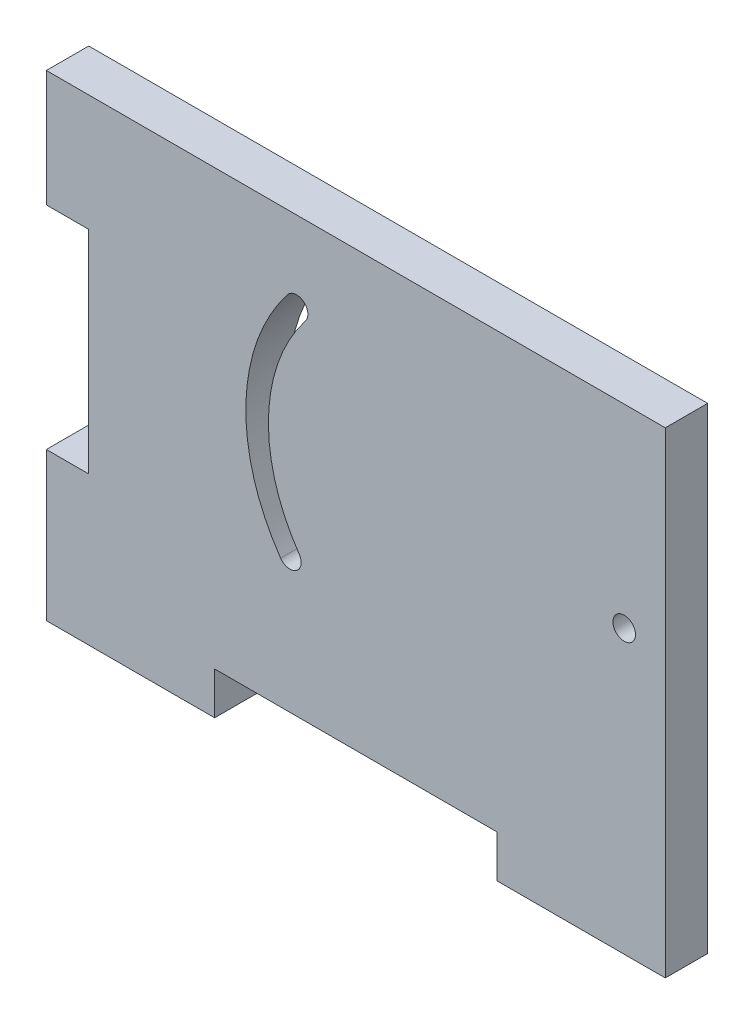
ISO-10303-21;
HEADER;
FILE_DESCRIPTION(('STEP AP214'),'2;1');
FILE_NAME('part.step','',(''),(''),'','','');
FILE_SCHEMA(('AUTOMOTIVE_DESIGN { 1 0 10303 214 1 1 1 1 }'));
ENDSEC;
DATA;
#1=APPLICATION_CONTEXT('core data for automotive mechanical design processes');
#2=APPLICATION_PROTOCOL_DEFINITION('international standard','automotive_design',2000,#1);
#3=PRODUCT_CONTEXT('',#1,'mechanical');
#4=PRODUCT('Part','Part','',(#3));
#5=PRODUCT_RELATED_PRODUCT_CATEGORY('part','',(#4));
#6=PRODUCT_DEFINITION_FORMATION('','',#4);
#7=PRODUCT_DEFINITION_CONTEXT('part definition',#1,'design');
#8=PRODUCT_DEFINITION('design','',#6,#7);
#9=PRODUCT_DEFINITION_SHAPE('','',#8);
#10=(LENGTH_UNIT() NAMED_UNIT(*) SI_UNIT(.MILLI.,.METRE.));
#11=(NAMED_UNIT(*) PLANE_ANGLE_UNIT() SI_UNIT($,.RADIAN.));
#12=(NAMED_UNIT(*) SI_UNIT($,.STERADIAN.) SOLID_ANGLE_UNIT());
#13=UNCERTAINTY_MEASURE_WITH_UNIT(LENGTH_MEASURE(1.E-05),#10,'distance_accuracy_value','');
#14=(GEOMETRIC_REPRESENTATION_CONTEXT(3) GLOBAL_UNCERTAINTY_ASSIGNED_CONTEXT((#13)) GLOBAL_UNIT_ASSIGNED_CONTEXT((#10,
#11,#12)) REPRESENTATION_CONTEXT('',''));
#15=CARTESIAN_POINT('',(0.,0.,0.));
#16=DIRECTION('',(0.,0.,1.));
#17=DIRECTION('',(1.,0.,0.));
#18=AXIS2_PLACEMENT_3D('',#15,#16,#17);
#19=CARTESIAN_POINT('',(-49.8558581563153,0.,6.));
#20=DIRECTION('',(-1.,0.,0.));
#21=DIRECTION('',(0.,-1.,0.));
#22=AXIS2_PLACEMENT_3D('',#19,#20,#21);
#23=PLANE('',#22);
#24=DIRECTION('',(0.,1.,0.));
#25=VECTOR('',#24,1.);
#26=CARTESIAN_POINT('',(-49.8558581563153,0.,0.));
#27=LINE('',#26,#25);
#28=CARTESIAN_POINT('',(-49.8558581563153,-19.,0.));
#29=VERTEX_POINT('',#28);
#30=CARTESIAN_POINT('',(-49.8558581563153,11.,0.));
#31=VERTEX_POINT('',#30);
#32=EDGE_CURVE('E313',#29,#31,#27,.T.);
#33=ORIENTED_EDGE('',*,*,#32,.F.);
#34=DIRECTION('',(0.,0.,-1.));
#35=VECTOR('',#34,1.);
#36=CARTESIAN_POINT('',(-49.8558581563153,-19.,6.));
#37=LINE('',#36,#35);
#38=CARTESIAN_POINT('',(-49.8558581563153,-19.,6.));
#39=VERTEX_POINT('',#38);
#40=EDGE_CURVE('E11',#39,#29,#37,.T.);
#41=ORIENTED_EDGE('',*,*,#40,.F.);
#42=DIRECTION('',(0.,1.,0.));
#43=VECTOR('',#42,1.);
#44=CARTESIAN_POINT('',(-49.8558581563153,0.,6.));
#45=LINE('',#44,#43);
#46=CARTESIAN_POINT('',(-49.8558581563153,11.,6.));
#47=VERTEX_POINT('',#46);
#48=EDGE_CURVE('E211',#39,#47,#45,.T.);
#49=ORIENTED_EDGE('',*,*,#48,.T.);
#50=DIRECTION('',(0.,0.,-1.));
#51=VECTOR('',#50,1.);
#52=CARTESIAN_POINT('',(-49.8558581563153,11.,6.));
#53=LINE('',#52,#51);
#54=EDGE_CURVE('E123',#47,#31,#53,.T.);
#55=ORIENTED_EDGE('',*,*,#54,.T.);
#56=EDGE_LOOP('',(#33,#41,#49,#55));
#57=FACE_BOUND('',#56,.T.);
#58=ADVANCED_FACE('F45',(#57),#23,.T.);
#59=CARTESIAN_POINT('',(0.,-19.,6.));
#60=DIRECTION('',(0.,1.,0.));
#61=DIRECTION('',(0.,0.,1.));
#62=AXIS2_PLACEMENT_3D('',#59,#60,#61);
#63=PLANE('',#62);
#64=DIRECTION('',(1.,0.,0.));
#65=VECTOR('',#64,1.);
#66=CARTESIAN_POINT('',(0.,-19.,0.));
#67=LINE('',#66,#65);
#68=CARTESIAN_POINT('',(-55.8558581563153,-19.,0.));
#69=VERTEX_POINT('',#68);
#70=EDGE_CURVE('E316',#69,#29,#67,.T.);
#71=ORIENTED_EDGE('',*,*,#70,.F.);
#72=DIRECTION('',(0.,0.,-1.));
#73=VECTOR('',#72,1.);
#74=CARTESIAN_POINT('',(-55.8558581563153,-19.,6.));
#75=LINE('',#74,#73);
#76=CARTESIAN_POINT('',(-55.8558581563153,-19.,6.));
#77=VERTEX_POINT('',#76);
#78=EDGE_CURVE('E56',#77,#69,#75,.T.);
#79=ORIENTED_EDGE('',*,*,#78,.F.);
#80=DIRECTION('',(1.,0.,0.));
#81=VECTOR('',#80,1.);
#82=CARTESIAN_POINT('',(0.,-19.,6.));
#83=LINE('',#82,#81);
#84=EDGE_CURVE('E202',#77,#39,#83,.T.);
#85=ORIENTED_EDGE('',*,*,#84,.T.);
#86=ORIENTED_EDGE('',*,*,#40,.T.);
#87=EDGE_LOOP('',(#71,#79,#85,#86));
#88=FACE_BOUND('',#87,.T.);
#89=ADVANCED_FACE('F372',(#88),#63,.T.);
#90=CARTESIAN_POINT('',(-55.8558581563153,0.,6.));
#91=DIRECTION('',(-1.,0.,0.));
#92=DIRECTION('',(0.,0.,1.));
#93=AXIS2_PLACEMENT_3D('',#90,#91,#92);
#94=PLANE('',#93);
#95=DIRECTION('',(0.,1.,0.));
#96=VECTOR('',#95,1.);
#97=CARTESIAN_POINT('',(-55.8558581563153,0.,0.));
#98=LINE('',#97,#96);
#99=CARTESIAN_POINT('',(-55.8558581563153,-40.,0.));
#100=VERTEX_POINT('',#99);
#101=EDGE_CURVE('E241',#100,#69,#98,.T.);
#102=ORIENTED_EDGE('',*,*,#101,.F.);
#103=DIRECTION('',(0.,0.,-1.));
#104=VECTOR('',#103,1.);
#105=CARTESIAN_POINT('',(-55.8558581563153,-40.,6.));
#106=LINE('',#105,#104);
#107=CARTESIAN_POINT('',(-55.8558581563153,-40.,6.));
#108=VERTEX_POINT('',#107);
#109=EDGE_CURVE('E269',#108,#100,#106,.T.);
#110=ORIENTED_EDGE('',*,*,#109,.F.);
#111=DIRECTION('',(0.,1.,0.));
#112=VECTOR('',#111,1.);
#113=CARTESIAN_POINT('',(-55.8558581563153,0.,6.));
#114=LINE('',#113,#112);
#115=EDGE_CURVE('E193',#108,#77,#114,.T.);
#116=ORIENTED_EDGE('',*,*,#115,.T.);
#117=ORIENTED_EDGE('',*,*,#78,.T.);
#118=EDGE_LOOP('',(#102,#110,#116,#117));
#119=FACE_BOUND('',#118,.T.);
#120=ADVANCED_FACE('F370',(#119),#94,.T.);
#121=CARTESIAN_POINT('',(0.,-40.,6.));
#122=DIRECTION('',(0.,1.,0.));
#123=DIRECTION('',(0.,0.,1.));
#124=AXIS2_PLACEMENT_3D('',#121,#122,#123);
#125=PLANE('',#124);
#126=DIRECTION('',(1.,0.,0.));
#127=VECTOR('',#126,1.);
#128=CARTESIAN_POINT('',(0.,-40.,0.));
#129=LINE('',#128,#127);
#130=CARTESIAN_POINT('',(-32.0182630164411,-40.,0.));
#131=VERTEX_POINT('',#130);
#132=EDGE_CURVE('E322',#100,#131,#129,.T.);
#133=ORIENTED_EDGE('',*,*,#132,.T.);
#134=DIRECTION('',(0.,0.,-1.));
#135=VECTOR('',#134,1.);
#136=CARTESIAN_POINT('',(-32.0182630164411,-40.,6.));
#137=LINE('',#136,#135);
#138=CARTESIAN_POINT('',(-32.0182630164411,-40.,6.));
#139=VERTEX_POINT('',#138);
#140=EDGE_CURVE('E265',#139,#131,#137,.T.);
#141=ORIENTED_EDGE('',*,*,#140,.F.);
#142=DIRECTION('',(1.,0.,0.));
#143=VECTOR('',#142,1.);
#144=CARTESIAN_POINT('',(0.,-40.,6.));
#145=LINE('',#144,#143);
#146=EDGE_CURVE('E201',#108,#139,#145,.T.);
#147=ORIENTED_EDGE('',*,*,#146,.F.);
#148=ORIENTED_EDGE('',*,*,#109,.T.);
#149=EDGE_LOOP('',(#133,#141,#147,#148));
#150=FACE_BOUND('',#149,.T.);
#151=ADVANCED_FACE('F369',(#150),#125,.F.);
#152=CARTESIAN_POINT('',(-32.0182630164411,0.,6.));
#153=DIRECTION('',(-1.,0.,0.));
#154=DIRECTION('',(0.,0.,1.));
#155=AXIS2_PLACEMENT_3D('',#152,#153,#154);
#156=PLANE('',#155);
#157=DIRECTION('',(0.,1.,0.));
#158=VECTOR('',#157,1.);
#159=CARTESIAN_POINT('',(-32.0182630164411,0.,0.));
#160=LINE('',#159,#158);
#161=CARTESIAN_POINT('',(-32.0182630164411,-34.,0.));
#162=VERTEX_POINT('',#161);
#163=EDGE_CURVE('E326',#131,#162,#160,.T.);
#164=ORIENTED_EDGE('',*,*,#163,.T.);
#165=DIRECTION('',(0.,0.,-1.));
#166=VECTOR('',#165,1.);
#167=CARTESIAN_POINT('',(-32.0182630164411,-34.,6.));
#168=LINE('',#167,#166);
#169=CARTESIAN_POINT('',(-32.0182630164411,-34.,6.));
#170=VERTEX_POINT('',#169);
#171=EDGE_CURVE('E261',#170,#162,#168,.T.);
#172=ORIENTED_EDGE('',*,*,#171,.F.);
#173=DIRECTION('',(0.,1.,0.));
#174=VECTOR('',#173,1.);
#175=CARTESIAN_POINT('',(-32.0182630164411,0.,6.));
#176=LINE('',#175,#174);
#177=EDGE_CURVE('E208',#139,#170,#176,.T.);
#178=ORIENTED_EDGE('',*,*,#177,.F.);
#179=ORIENTED_EDGE('',*,*,#140,.T.);
#180=EDGE_LOOP('',(#164,#172,#178,#179));
#181=FACE_BOUND('',#180,.T.);
#182=ADVANCED_FACE('F365',(#181),#156,.F.);
#183=CARTESIAN_POINT('',(0.,-34.,6.));
#184=DIRECTION('',(0.,1.,0.));
#185=DIRECTION('',(0.,0.,1.));
#186=AXIS2_PLACEMENT_3D('',#183,#184,#185);
#187=PLANE('',#186);
#188=DIRECTION('',(1.,0.,0.));
#189=VECTOR('',#188,1.);
#190=CARTESIAN_POINT('',(0.,-34.,0.));
#191=LINE('',#190,#189);
#192=CARTESIAN_POINT('',(7.98173698355886,-34.,0.));
#193=VERTEX_POINT('',#192);
#194=EDGE_CURVE('E331',#162,#193,#191,.T.);
#195=ORIENTED_EDGE('',*,*,#194,.T.);
#196=DIRECTION('',(0.,0.,-1.));
#197=VECTOR('',#196,1.);
#198=CARTESIAN_POINT('',(7.98173698355886,-34.,6.));
#199=LINE('',#198,#197);
#200=CARTESIAN_POINT('',(7.98173698355886,-34.,6.));
#201=VERTEX_POINT('',#200);
#202=EDGE_CURVE('E258',#201,#193,#199,.T.);
#203=ORIENTED_EDGE('',*,*,#202,.F.);
#204=DIRECTION('',(1.,0.,0.));
#205=VECTOR('',#204,1.);
#206=CARTESIAN_POINT('',(0.,-34.,6.));
#207=LINE('',#206,#205);
#208=EDGE_CURVE('E573',#170,#201,#207,.T.);
#209=ORIENTED_EDGE('',*,*,#208,.F.);
#210=ORIENTED_EDGE('',*,*,#171,.T.);
#211=EDGE_LOOP('',(#195,#203,#209,#210));
#212=FACE_BOUND('',#211,.T.);
#213=ADVANCED_FACE('F359',(#212),#187,.F.);
#214=CARTESIAN_POINT('',(7.98173698355886,0.,6.));
#215=DIRECTION('',(-1.,0.,0.));
#216=DIRECTION('',(0.,0.,1.));
#217=AXIS2_PLACEMENT_3D('',#214,#215,#216);
#218=PLANE('',#217);
#219=DIRECTION('',(0.,1.,0.));
#220=VECTOR('',#219,1.);
#221=CARTESIAN_POINT('',(7.98173698355886,0.,0.));
#222=LINE('',#221,#220);
#223=CARTESIAN_POINT('',(7.98173698355886,-40.,0.));
#224=VERTEX_POINT('',#223);
#225=EDGE_CURVE('E335',#224,#193,#222,.T.);
#226=ORIENTED_EDGE('',*,*,#225,.F.);
#227=DIRECTION('',(0.,0.,-1.));
#228=VECTOR('',#227,1.);
#229=CARTESIAN_POINT('',(7.98173698355886,-40.,6.));
#230=LINE('',#229,#228);
#231=CARTESIAN_POINT('',(7.98173698355886,-40.,6.));
#232=VERTEX_POINT('',#231);
#233=EDGE_CURVE('E255',#232,#224,#230,.T.);
#234=ORIENTED_EDGE('',*,*,#233,.F.);
#235=DIRECTION('',(0.,1.,0.));
#236=VECTOR('',#235,1.);
#237=CARTESIAN_POINT('',(7.98173698355886,0.,6.));
#238=LINE('',#237,#236);
#239=EDGE_CURVE('E357',#232,#201,#238,.T.);
#240=ORIENTED_EDGE('',*,*,#239,.T.);
#241=ORIENTED_EDGE('',*,*,#202,.T.);
#242=EDGE_LOOP('',(#226,#234,#240,#241));
#243=FACE_BOUND('',#242,.T.);
#244=ADVANCED_FACE('F353',(#243),#218,.T.);
#245=CARTESIAN_POINT('',(31.819332123433,-40.,0.));
#246=VERTEX_POINT('',#245);
#247=EDGE_CURVE('E327',#224,#246,#129,.T.);
#248=ORIENTED_EDGE('',*,*,#247,.T.);
#249=DIRECTION('',(0.,0.,-1.));
#250=VECTOR('',#249,1.);
#251=CARTESIAN_POINT('',(31.819332123433,-40.,6.));
#252=LINE('',#251,#250);
#253=CARTESIAN_POINT('',(31.819332123433,-40.,6.));
#254=VERTEX_POINT('',#253);
#255=EDGE_CURVE('E251',#254,#246,#252,.T.);
#256=ORIENTED_EDGE('',*,*,#255,.F.);
#257=EDGE_CURVE('E209',#232,#254,#145,.T.);
#258=ORIENTED_EDGE('',*,*,#257,.F.);
#259=ORIENTED_EDGE('',*,*,#233,.T.);
#260=EDGE_LOOP('',(#248,#256,#258,#259));
#261=FACE_BOUND('',#260,.T.);
#262=ADVANCED_FACE('F348',(#261),#125,.F.);
#263=CARTESIAN_POINT('',(31.819332123433,0.,6.));
#264=DIRECTION('',(-1.,0.,0.));
#265=DIRECTION('',(0.,0.,1.));
#266=AXIS2_PLACEMENT_3D('',#263,#264,#265);
#267=PLANE('',#266);
#268=DIRECTION('',(0.,1.,0.));
#269=VECTOR('',#268,1.);
#270=CARTESIAN_POINT('',(31.819332123433,0.,0.));
#271=LINE('',#270,#269);
#272=CARTESIAN_POINT('',(31.819332123433,27.4983223368587,0.));
#273=VERTEX_POINT('',#272);
#274=EDGE_CURVE('E338',#246,#273,#271,.T.);
#275=ORIENTED_EDGE('',*,*,#274,.T.);
#276=DIRECTION('',(0.,0.,-1.));
#277=VECTOR('',#276,1.);
#278=CARTESIAN_POINT('',(31.819332123433,27.4983223368587,6.));
#279=LINE('',#278,#277);
#280=CARTESIAN_POINT('',(31.819332123433,27.4983223368587,6.));
#281=VERTEX_POINT('',#280);
#282=EDGE_CURVE('E181',#281,#273,#279,.T.);
#283=ORIENTED_EDGE('',*,*,#282,.F.);
#284=DIRECTION('',(0.,1.,0.));
#285=VECTOR('',#284,1.);
#286=CARTESIAN_POINT('',(31.819332123433,0.,6.));
#287=LINE('',#286,#285);
#288=EDGE_CURVE('E186',#254,#281,#287,.T.);
#289=ORIENTED_EDGE('',*,*,#288,.F.);
#290=ORIENTED_EDGE('',*,*,#255,.T.);
#291=EDGE_LOOP('',(#275,#283,#289,#290));
#292=FACE_BOUND('',#291,.T.);
#293=ADVANCED_FACE('F403',(#292),#267,.F.);
#294=CARTESIAN_POINT('',(0.,27.4983223368587,6.));
#295=DIRECTION('',(0.,1.,0.));
#296=DIRECTION('',(-1.,0.,0.));
#297=AXIS2_PLACEMENT_3D('',#294,#295,#296);
#298=PLANE('',#297);
#299=DIRECTION('',(1.,0.,0.));
#300=VECTOR('',#299,1.);
#301=CARTESIAN_POINT('',(0.,27.4983223368587,0.));
#302=LINE('',#301,#300);
#303=CARTESIAN_POINT('',(-55.8558581563153,27.4983223368587,0.));
#304=VERTEX_POINT('',#303);
#305=EDGE_CURVE('E175',#304,#273,#302,.T.);
#306=ORIENTED_EDGE('',*,*,#305,.F.);
#307=DIRECTION('',(0.,0.,-1.));
#308=VECTOR('',#307,1.);
#309=CARTESIAN_POINT('',(-55.8558581563153,27.4983223368587,6.));
#310=LINE('',#309,#308);
#311=CARTESIAN_POINT('',(-55.8558581563153,27.4983223368587,6.));
#312=VERTEX_POINT('',#311);
#313=EDGE_CURVE('E170',#312,#304,#310,.T.);
#314=ORIENTED_EDGE('',*,*,#313,.F.);
#315=DIRECTION('',(1.,0.,0.));
#316=VECTOR('',#315,1.);
#317=CARTESIAN_POINT('',(0.,27.4983223368587,6.));
#318=LINE('',#317,#316);
#319=EDGE_CURVE('E173',#312,#281,#318,.T.);
#320=ORIENTED_EDGE('',*,*,#319,.T.);
#321=ORIENTED_EDGE('',*,*,#282,.T.);
#322=EDGE_LOOP('',(#306,#314,#320,#321));
#323=FACE_BOUND('',#322,.T.);
#324=ADVANCED_FACE('F172',(#323),#298,.T.);
#325=CARTESIAN_POINT('',(-55.8558581563153,11.,0.));
#326=VERTEX_POINT('',#325);
#327=EDGE_CURVE('E236',#326,#304,#98,.T.);
#328=ORIENTED_EDGE('',*,*,#327,.F.);
#329=DIRECTION('',(0.,0.,-1.));
#330=VECTOR('',#329,1.);
#331=CARTESIAN_POINT('',(-55.8558581563153,11.,6.));
#332=LINE('',#331,#330);
#333=CARTESIAN_POINT('',(-55.8558581563153,11.,6.));
#334=VERTEX_POINT('',#333);
#335=EDGE_CURVE('E116',#334,#326,#332,.T.);
#336=ORIENTED_EDGE('',*,*,#335,.F.);
#337=EDGE_CURVE('E184',#334,#312,#114,.T.);
#338=ORIENTED_EDGE('',*,*,#337,.T.);
#339=ORIENTED_EDGE('',*,*,#313,.T.);
#340=EDGE_LOOP('',(#328,#336,#338,#339));
#341=FACE_BOUND('',#340,.T.);
#342=ADVANCED_FACE('F190',(#341),#94,.T.);
#343=CARTESIAN_POINT('',(-21.3570685447965,-14.8282036394454,6.));
#344=DIRECTION('',(0.,0.,-1.));
#345=DIRECTION('',(-1.,0.,0.));
#346=AXIS2_PLACEMENT_3D('',#343,#344,#345);
#347=CYLINDRICAL_SURFACE('',#346,1.6);
#348=CARTESIAN_POINT('',(-21.3570685447965,-14.8282036394454,0.));
#349=DIRECTION('',(0.,0.,1.));
#350=DIRECTION('',(1.,0.,0.));
#351=AXIS2_PLACEMENT_3D('',#348,#349,#350);
#352=CIRCLE('',#351,1.6);
#353=CARTESIAN_POINT('',(-22.6713496860148,-15.7407084787959,0.));
#354=VERTEX_POINT('',#353);
#355=CARTESIAN_POINT('',(-20.0427874035783,-13.9156988000949,0.));
#356=VERTEX_POINT('',#355);
#357=EDGE_CURVE('E291',#354,#356,#352,.T.);
#358=ORIENTED_EDGE('',*,*,#357,.F.);
#359=DIRECTION('',(0.,0.,-1.));
#360=VECTOR('',#359,1.);
#361=CARTESIAN_POINT('',(-22.6713496860148,-15.7407084787959,6.));
#362=LINE('',#361,#360);
#363=CARTESIAN_POINT('',(-22.6713496860148,-15.7407084787959,6.));
#364=VERTEX_POINT('',#363);
#365=EDGE_CURVE('E49',#364,#354,#362,.T.);
#366=ORIENTED_EDGE('',*,*,#365,.F.);
#367=CARTESIAN_POINT('',(-21.3570685447965,-14.8282036394454,6.));
#368=DIRECTION('',(0.,0.,1.));
#369=DIRECTION('',(1.,0.,0.));
#370=AXIS2_PLACEMENT_3D('',#367,#368,#369);
#371=CIRCLE('',#370,1.6);
#372=CARTESIAN_POINT('',(-20.0427874035783,-13.9156988000949,6.));
#373=VERTEX_POINT('',#372);
#374=EDGE_CURVE('E232',#364,#373,#371,.T.);
#375=ORIENTED_EDGE('',*,*,#374,.T.);
#376=DIRECTION('',(0.,0.,-1.));
#377=VECTOR('',#376,1.);
#378=CARTESIAN_POINT('',(-20.0427874035783,-13.9156988000949,6.));
#379=LINE('',#378,#377);
#380=EDGE_CURVE('E195',#373,#356,#379,.T.);
#381=ORIENTED_EDGE('',*,*,#380,.T.);
#382=EDGE_LOOP('',(#358,#366,#375,#381));
#383=FACE_BOUND('',#382,.T.);
#384=ADVANCED_FACE('F47',(#383),#347,.F.);
#385=CARTESIAN_POINT('',(0.,0.,6.));
#386=DIRECTION('',(0.,0.,-1.));
#387=DIRECTION('',(-1.,0.,0.));
#388=AXIS2_PLACEMENT_3D('',#385,#386,#387);
#389=CYLINDRICAL_SURFACE('',#388,27.6);
#390=CARTESIAN_POINT('',(0.,0.,0.));
#391=DIRECTION('',(0.,0.,1.));
#392=DIRECTION('',(1.,0.,0.));
#393=AXIS2_PLACEMENT_3D('',#390,#391,#392);
#394=CIRCLE('',#393,27.6);
#395=CARTESIAN_POINT('',(-21.6675285766619,17.0961459218018,0.));
#396=VERTEX_POINT('',#395);
#397=EDGE_CURVE('E287',#396,#354,#394,.T.);
#398=ORIENTED_EDGE('',*,*,#397,.F.);
#399=DIRECTION('',(0.,0.,-1.));
#400=VECTOR('',#399,1.);
#401=CARTESIAN_POINT('',(-21.6675285766619,17.0961459218018,6.));
#402=LINE('',#401,#400);
#403=CARTESIAN_POINT('',(-21.6675285766619,17.0961459218018,6.));
#404=VERTEX_POINT('',#403);
#405=EDGE_CURVE('E278',#404,#396,#402,.T.);
#406=ORIENTED_EDGE('',*,*,#405,.F.);
#407=CARTESIAN_POINT('',(0.,0.,6.));
#408=DIRECTION('',(0.,0.,1.));
#409=DIRECTION('',(1.,0.,0.));
#410=AXIS2_PLACEMENT_3D('',#407,#408,#409);
#411=CIRCLE('',#410,27.6);
#412=EDGE_CURVE('E228',#404,#364,#411,.T.);
#413=ORIENTED_EDGE('',*,*,#412,.T.);
#414=ORIENTED_EDGE('',*,*,#365,.T.);
#415=EDGE_LOOP('',(#398,#406,#413,#414));
#416=FACE_BOUND('',#415,.T.);
#417=ADVANCED_FACE('F285',(#416),#389,.F.);
#418=CARTESIAN_POINT('',(-20.4114399635221,16.1050649987988,6.));
#419=DIRECTION('',(0.,0.,-1.));
#420=DIRECTION('',(-1.,0.,0.));
#421=AXIS2_PLACEMENT_3D('',#418,#419,#420);
#422=CYLINDRICAL_SURFACE('',#421,1.6);
#423=CARTESIAN_POINT('',(-20.4114399635221,16.1050649987988,0.));
#424=DIRECTION('',(0.,0.,1.));
#425=DIRECTION('',(1.,0.,0.));
#426=AXIS2_PLACEMENT_3D('',#423,#424,#425);
#427=CIRCLE('',#426,1.6);
#428=CARTESIAN_POINT('',(-19.1553513503823,15.1139840757958,0.));
#429=VERTEX_POINT('',#428);
#430=EDGE_CURVE('E300',#429,#396,#427,.T.);
#431=ORIENTED_EDGE('',*,*,#430,.F.);
#432=DIRECTION('',(0.,0.,-1.));
#433=VECTOR('',#432,1.);
#434=CARTESIAN_POINT('',(-19.1553513503823,15.1139840757958,6.));
#435=LINE('',#434,#433);
#436=CARTESIAN_POINT('',(-19.1553513503823,15.1139840757958,6.));
#437=VERTEX_POINT('',#436);
#438=EDGE_CURVE('E276',#437,#429,#435,.T.);
#439=ORIENTED_EDGE('',*,*,#438,.F.);
#440=CARTESIAN_POINT('',(-20.4114399635221,16.1050649987988,6.));
#441=DIRECTION('',(0.,0.,1.));
#442=DIRECTION('',(1.,0.,0.));
#443=AXIS2_PLACEMENT_3D('',#440,#441,#442);
#444=CIRCLE('',#443,1.6);
#445=EDGE_CURVE('E224',#437,#404,#444,.T.);
#446=ORIENTED_EDGE('',*,*,#445,.T.);
#447=ORIENTED_EDGE('',*,*,#405,.T.);
#448=EDGE_LOOP('',(#431,#439,#446,#447));
#449=FACE_BOUND('',#448,.T.);
#450=ADVANCED_FACE('F385',(#449),#422,.F.);
#451=CARTESIAN_POINT('',(26.,0.,6.));
#452=DIRECTION('',(0.,0.,-1.));
#453=DIRECTION('',(-1.,0.,0.));
#454=AXIS2_PLACEMENT_3D('',#451,#452,#453);
#455=CYLINDRICAL_SURFACE('',#454,1.6);
#456=CARTESIAN_POINT('',(26.,0.,6.));
#457=DIRECTION('',(0.,0.,1.));
#458=DIRECTION('',(1.,0.,0.));
#459=AXIS2_PLACEMENT_3D('',#456,#457,#458);
#460=CIRCLE('',#459,1.6);
#461=CARTESIAN_POINT('',(27.6,0.,6.));
#462=VERTEX_POINT('',#461);
#463=EDGE_CURVE('E215',#462,#462,#460,.T.);
#464=ORIENTED_EDGE('',*,*,#463,.T.);
#465=EDGE_LOOP('',(#464));
#466=FACE_BOUND('',#465,.T.);
#467=CARTESIAN_POINT('',(26.,0.,0.));
#468=DIRECTION('',(0.,0.,1.));
#469=DIRECTION('',(1.,0.,0.));
#470=AXIS2_PLACEMENT_3D('',#467,#468,#469);
#471=CIRCLE('',#470,1.6);
#472=CARTESIAN_POINT('',(27.6,0.,0.));
#473=VERTEX_POINT('',#472);
#474=EDGE_CURVE('E309',#473,#473,#471,.T.);
#475=ORIENTED_EDGE('',*,*,#474,.F.);
#476=EDGE_LOOP('',(#475));
#477=FACE_BOUND('',#476,.T.);
#478=ADVANCED_FACE('F381',(#466,#477),#455,.F.);
#479=CARTESIAN_POINT('',(0.,0.,6.));
#480=DIRECTION('',(0.,0.,-1.));
#481=DIRECTION('',(-1.,0.,0.));
#482=AXIS2_PLACEMENT_3D('',#479,#480,#481);
#483=CYLINDRICAL_SURFACE('',#482,24.4);
#484=CARTESIAN_POINT('',(0.,0.,0.));
#485=DIRECTION('',(0.,0.,1.));
#486=DIRECTION('',(1.,0.,0.));
#487=AXIS2_PLACEMENT_3D('',#484,#485,#486);
#488=CIRCLE('',#487,24.4);
#489=EDGE_CURVE('E304',#429,#356,#488,.T.);
#490=ORIENTED_EDGE('',*,*,#489,.T.);
#491=ORIENTED_EDGE('',*,*,#380,.F.);
#492=CARTESIAN_POINT('',(0.,0.,6.));
#493=DIRECTION('',(0.,0.,1.));
#494=DIRECTION('',(1.,0.,0.));
#495=AXIS2_PLACEMENT_3D('',#492,#493,#494);
#496=CIRCLE('',#495,24.4);
#497=EDGE_CURVE('E221',#437,#373,#496,.T.);
#498=ORIENTED_EDGE('',*,*,#497,.F.);
#499=ORIENTED_EDGE('',*,*,#438,.T.);
#500=EDGE_LOOP('',(#490,#491,#498,#499));
#501=FACE_BOUND('',#500,.T.);
#502=ADVANCED_FACE('F384',(#501),#483,.T.);
#503=CARTESIAN_POINT('',(0.,11.,6.));
#504=DIRECTION('',(0.,1.,0.));
#505=DIRECTION('',(-1.,0.,0.));
#506=AXIS2_PLACEMENT_3D('',#503,#504,#505);
#507=PLANE('',#506);
#508=DIRECTION('',(1.,0.,0.));
#509=VECTOR('',#508,1.);
#510=CARTESIAN_POINT('',(0.,11.,0.));
#511=LINE('',#510,#509);
#512=EDGE_CURVE('E234',#326,#31,#511,.T.);
#513=ORIENTED_EDGE('',*,*,#512,.T.);
#514=ORIENTED_EDGE('',*,*,#54,.F.);
#515=DIRECTION('',(1.,0.,0.));
#516=VECTOR('',#515,1.);
#517=CARTESIAN_POINT('',(0.,11.,6.));
#518=LINE('',#517,#516);
#519=EDGE_CURVE('E65',#334,#47,#518,.T.);
#520=ORIENTED_EDGE('',*,*,#519,.F.);
#521=ORIENTED_EDGE('',*,*,#335,.T.);
#522=EDGE_LOOP('',(#513,#514,#520,#521));
#523=FACE_BOUND('',#522,.T.);
#524=ADVANCED_FACE('F389',(#523),#507,.F.);
#525=CARTESIAN_POINT('',(0.,0.,6.));
#526=DIRECTION('',(0.,0.,1.));
#527=DIRECTION('',(1.,0.,0.));
#528=AXIS2_PLACEMENT_3D('',#525,#526,#527);
#529=PLANE('',#528);
#530=ORIENTED_EDGE('',*,*,#374,.F.);
#531=ORIENTED_EDGE('',*,*,#412,.F.);
#532=ORIENTED_EDGE('',*,*,#445,.F.);
#533=ORIENTED_EDGE('',*,*,#497,.T.);
#534=EDGE_LOOP('',(#530,#531,#532,#533));
#535=FACE_BOUND('',#534,.T.);
#536=ORIENTED_EDGE('',*,*,#463,.F.);
#537=EDGE_LOOP('',(#536));
#538=FACE_BOUND('',#537,.T.);
#539=ORIENTED_EDGE('',*,*,#48,.F.);
#540=ORIENTED_EDGE('',*,*,#84,.F.);
#541=ORIENTED_EDGE('',*,*,#115,.F.);
#542=ORIENTED_EDGE('',*,*,#146,.T.);
#543=ORIENTED_EDGE('',*,*,#177,.T.);
#544=ORIENTED_EDGE('',*,*,#208,.T.);
#545=ORIENTED_EDGE('',*,*,#239,.F.);
#546=ORIENTED_EDGE('',*,*,#257,.T.);
#547=ORIENTED_EDGE('',*,*,#288,.T.);
#548=ORIENTED_EDGE('',*,*,#319,.F.);
#549=ORIENTED_EDGE('',*,*,#337,.F.);
#550=ORIENTED_EDGE('',*,*,#519,.T.);
#551=EDGE_LOOP('',(#539,#540,#541,#542,#543,#544,#545,#546,#547,#548,#549,#550));
#552=FACE_BOUND('',#551,.T.);
#553=ADVANCED_FACE('F183',(#535,#538,#552),#529,.T.);
#554=CARTESIAN_POINT('',(0.,0.,0.));
#555=DIRECTION('',(0.,0.,1.));
#556=DIRECTION('',(1.,0.,0.));
#557=AXIS2_PLACEMENT_3D('',#554,#555,#556);
#558=PLANE('',#557);
#559=ORIENTED_EDGE('',*,*,#357,.T.);
#560=ORIENTED_EDGE('',*,*,#489,.F.);
#561=ORIENTED_EDGE('',*,*,#430,.T.);
#562=ORIENTED_EDGE('',*,*,#397,.T.);
#563=EDGE_LOOP('',(#559,#560,#561,#562));
#564=FACE_BOUND('',#563,.T.);
#565=ORIENTED_EDGE('',*,*,#474,.T.);
#566=EDGE_LOOP('',(#565));
#567=FACE_BOUND('',#566,.T.);
#568=ORIENTED_EDGE('',*,*,#32,.T.);
#569=ORIENTED_EDGE('',*,*,#512,.F.);
#570=ORIENTED_EDGE('',*,*,#327,.T.);
#571=ORIENTED_EDGE('',*,*,#305,.T.);
#572=ORIENTED_EDGE('',*,*,#274,.F.);
#573=ORIENTED_EDGE('',*,*,#247,.F.);
#574=ORIENTED_EDGE('',*,*,#225,.T.);
#575=ORIENTED_EDGE('',*,*,#194,.F.);
#576=ORIENTED_EDGE('',*,*,#163,.F.);
#577=ORIENTED_EDGE('',*,*,#132,.F.);
#578=ORIENTED_EDGE('',*,*,#101,.T.);
#579=ORIENTED_EDGE('',*,*,#70,.T.);
#580=EDGE_LOOP('',(#568,#569,#570,#571,#572,#573,#574,#575,#576,#577,#578,#579));
#581=FACE_BOUND('',#580,.T.);
#582=ADVANCED_FACE('F298',(#564,#567,#581),#558,.F.);
#583=CLOSED_SHELL('',(#58,#89,#120,#151,#182,#213,#244,#262,#293,#324,#342,#384,#417,#450,#478,
#502,#524,#553,#582));
#584=MANIFOLD_SOLID_BREP('B2',#583);
#585=ADVANCED_BREP_SHAPE_REPRESENTATION('',(#18,#584),#14);
#586=SHAPE_DEFINITION_REPRESENTATION(#9,#585);
ENDSEC;
END-ISO-10303-21;
